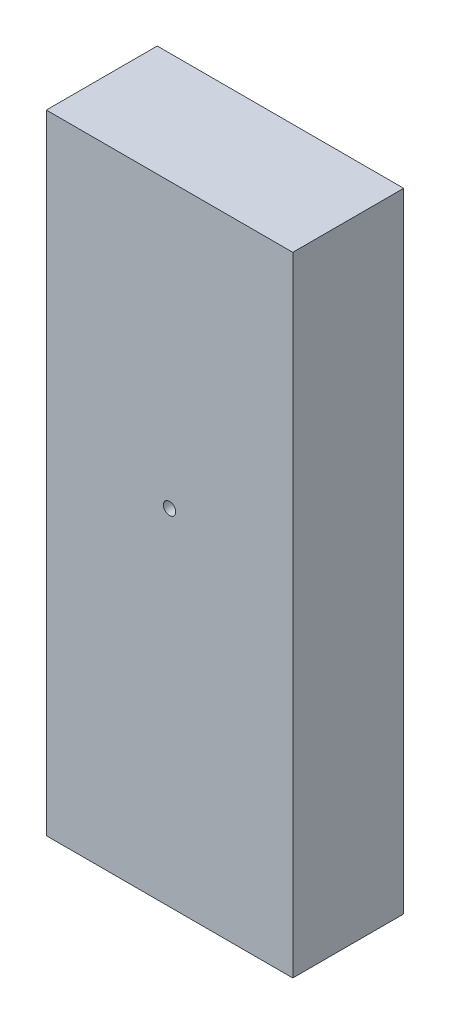
ISO-10303-21;
HEADER;
FILE_DESCRIPTION(('STEP AP214'),'2;1');
FILE_NAME('part.step','',(''),(''),'','','');
FILE_SCHEMA(('AUTOMOTIVE_DESIGN { 1 0 10303 214 1 1 1 1 }'));
ENDSEC;
DATA;
#1=APPLICATION_CONTEXT('core data for automotive mechanical design processes');
#2=APPLICATION_PROTOCOL_DEFINITION('international standard','automotive_design',2000,#1);
#3=PRODUCT_CONTEXT('',#1,'mechanical');
#4=PRODUCT('Part','Part','',(#3));
#5=PRODUCT_RELATED_PRODUCT_CATEGORY('part','',(#4));
#6=PRODUCT_DEFINITION_FORMATION('','',#4);
#7=PRODUCT_DEFINITION_CONTEXT('part definition',#1,'design');
#8=PRODUCT_DEFINITION('design','',#6,#7);
#9=PRODUCT_DEFINITION_SHAPE('','',#8);
#10=(LENGTH_UNIT() NAMED_UNIT(*) SI_UNIT(.MILLI.,.METRE.));
#11=(NAMED_UNIT(*) PLANE_ANGLE_UNIT() SI_UNIT($,.RADIAN.));
#12=(NAMED_UNIT(*) SI_UNIT($,.STERADIAN.) SOLID_ANGLE_UNIT());
#13=UNCERTAINTY_MEASURE_WITH_UNIT(LENGTH_MEASURE(1.E-05),#10,'distance_accuracy_value','');
#14=(GEOMETRIC_REPRESENTATION_CONTEXT(3) GLOBAL_UNCERTAINTY_ASSIGNED_CONTEXT((#13)) GLOBAL_UNIT_ASSIGNED_CONTEXT((#10,
#11,#12)) REPRESENTATION_CONTEXT('',''));
#15=CARTESIAN_POINT('',(0.,0.,0.));
#16=DIRECTION('',(0.,0.,1.));
#17=DIRECTION('',(1.,0.,0.));
#18=AXIS2_PLACEMENT_3D('',#15,#16,#17);
#19=CARTESIAN_POINT('',(-15.9031235431236,5.08846153846154,9.));
#20=DIRECTION('',(1.,0.,0.));
#21=DIRECTION('',(0.,1.,0.));
#22=AXIS2_PLACEMENT_3D('',#19,#20,#21);
#23=PLANE('',#22);
#24=DIRECTION('',(0.,-1.,0.));
#25=VECTOR('',#24,1.);
#26=CARTESIAN_POINT('',(-15.9031235431236,5.08846153846154,0.));
#27=LINE('',#26,#25);
#28=CARTESIAN_POINT('',(-15.9031235431236,5.08846153846154,0.));
#29=VERTEX_POINT('',#28);
#30=CARTESIAN_POINT('',(-15.9031235431236,-45.9115384615385,0.));
#31=VERTEX_POINT('',#30);
#32=EDGE_CURVE('E93',#29,#31,#27,.T.);
#33=ORIENTED_EDGE('',*,*,#32,.T.);
#34=DIRECTION('',(0.,0.,-1.));
#35=VECTOR('',#34,1.);
#36=CARTESIAN_POINT('',(-15.9031235431236,-45.9115384615385,9.));
#37=LINE('',#36,#35);
#38=CARTESIAN_POINT('',(-15.9031235431236,-45.9115384615385,9.));
#39=VERTEX_POINT('',#38);
#40=EDGE_CURVE('E11',#39,#31,#37,.T.);
#41=ORIENTED_EDGE('',*,*,#40,.F.);
#42=DIRECTION('',(0.,-1.,0.));
#43=VECTOR('',#42,1.);
#44=CARTESIAN_POINT('',(-15.9031235431236,5.08846153846154,9.));
#45=LINE('',#44,#43);
#46=CARTESIAN_POINT('',(-15.9031235431236,5.08846153846154,9.));
#47=VERTEX_POINT('',#46);
#48=EDGE_CURVE('E81',#47,#39,#45,.T.);
#49=ORIENTED_EDGE('',*,*,#48,.F.);
#50=DIRECTION('',(0.,0.,-1.));
#51=VECTOR('',#50,1.);
#52=CARTESIAN_POINT('',(-15.9031235431236,5.08846153846154,9.));
#53=LINE('',#52,#51);
#54=EDGE_CURVE('E89',#47,#29,#53,.T.);
#55=ORIENTED_EDGE('',*,*,#54,.T.);
#56=EDGE_LOOP('',(#33,#41,#49,#55));
#57=FACE_BOUND('',#56,.T.);
#58=ADVANCED_FACE('F30',(#57),#23,.F.);
#59=CARTESIAN_POINT('',(-15.9031235431236,-45.9115384615385,9.));
#60=DIRECTION('',(0.,1.,0.));
#61=DIRECTION('',(0.,0.,1.));
#62=AXIS2_PLACEMENT_3D('',#59,#60,#61);
#63=PLANE('',#62);
#64=DIRECTION('',(1.,0.,0.));
#65=VECTOR('',#64,1.);
#66=CARTESIAN_POINT('',(-15.9031235431236,-45.9115384615385,0.));
#67=LINE('',#66,#65);
#68=CARTESIAN_POINT('',(4.09687645687644,-45.9115384615385,0.));
#69=VERTEX_POINT('',#68);
#70=EDGE_CURVE('E85',#31,#69,#67,.T.);
#71=ORIENTED_EDGE('',*,*,#70,.T.);
#72=DIRECTION('',(0.,0.,-1.));
#73=VECTOR('',#72,1.);
#74=CARTESIAN_POINT('',(4.09687645687644,-45.9115384615385,9.));
#75=LINE('',#74,#73);
#76=CARTESIAN_POINT('',(4.09687645687644,-45.9115384615385,9.));
#77=VERTEX_POINT('',#76);
#78=EDGE_CURVE('E38',#77,#69,#75,.T.);
#79=ORIENTED_EDGE('',*,*,#78,.F.);
#80=DIRECTION('',(1.,0.,0.));
#81=VECTOR('',#80,1.);
#82=CARTESIAN_POINT('',(-15.9031235431236,-45.9115384615385,9.));
#83=LINE('',#82,#81);
#84=EDGE_CURVE('E76',#39,#77,#83,.T.);
#85=ORIENTED_EDGE('',*,*,#84,.F.);
#86=ORIENTED_EDGE('',*,*,#40,.T.);
#87=EDGE_LOOP('',(#71,#79,#85,#86));
#88=FACE_BOUND('',#87,.T.);
#89=ADVANCED_FACE('F84',(#88),#63,.F.);
#90=CARTESIAN_POINT('',(4.09687645687643,5.08846153846154,9.));
#91=DIRECTION('',(-1.,0.,0.));
#92=DIRECTION('',(0.,-1.,0.));
#93=AXIS2_PLACEMENT_3D('',#90,#91,#92);
#94=PLANE('',#93);
#95=DIRECTION('',(0.,1.,0.));
#96=VECTOR('',#95,1.);
#97=CARTESIAN_POINT('',(4.09687645687643,5.08846153846154,0.));
#98=LINE('',#97,#96);
#99=CARTESIAN_POINT('',(4.09687645687643,5.08846153846154,0.));
#100=VERTEX_POINT('',#99);
#101=EDGE_CURVE('E63',#69,#100,#98,.T.);
#102=ORIENTED_EDGE('',*,*,#101,.T.);
#103=DIRECTION('',(0.,0.,-1.));
#104=VECTOR('',#103,1.);
#105=CARTESIAN_POINT('',(4.09687645687643,5.08846153846154,9.));
#106=LINE('',#105,#104);
#107=CARTESIAN_POINT('',(4.09687645687643,5.08846153846154,9.));
#108=VERTEX_POINT('',#107);
#109=EDGE_CURVE('E86',#108,#100,#106,.T.);
#110=ORIENTED_EDGE('',*,*,#109,.F.);
#111=DIRECTION('',(0.,1.,0.));
#112=VECTOR('',#111,1.);
#113=CARTESIAN_POINT('',(4.09687645687643,5.08846153846154,9.));
#114=LINE('',#113,#112);
#115=EDGE_CURVE('E79',#77,#108,#114,.T.);
#116=ORIENTED_EDGE('',*,*,#115,.F.);
#117=ORIENTED_EDGE('',*,*,#78,.T.);
#118=EDGE_LOOP('',(#102,#110,#116,#117));
#119=FACE_BOUND('',#118,.T.);
#120=ADVANCED_FACE('F87',(#119),#94,.F.);
#121=CARTESIAN_POINT('',(-15.9031235431236,5.08846153846154,9.));
#122=DIRECTION('',(0.,-1.,0.));
#123=DIRECTION('',(0.,0.,-1.));
#124=AXIS2_PLACEMENT_3D('',#121,#122,#123);
#125=PLANE('',#124);
#126=DIRECTION('',(-1.,0.,0.));
#127=VECTOR('',#126,1.);
#128=CARTESIAN_POINT('',(-15.9031235431236,5.08846153846154,0.));
#129=LINE('',#128,#127);
#130=EDGE_CURVE('E69',#100,#29,#129,.T.);
#131=ORIENTED_EDGE('',*,*,#130,.T.);
#132=ORIENTED_EDGE('',*,*,#54,.F.);
#133=DIRECTION('',(-1.,0.,0.));
#134=VECTOR('',#133,1.);
#135=CARTESIAN_POINT('',(-15.9031235431236,5.08846153846154,9.));
#136=LINE('',#135,#134);
#137=EDGE_CURVE('E46',#108,#47,#136,.T.);
#138=ORIENTED_EDGE('',*,*,#137,.F.);
#139=ORIENTED_EDGE('',*,*,#109,.T.);
#140=EDGE_LOOP('',(#131,#132,#138,#139));
#141=FACE_BOUND('',#140,.T.);
#142=ADVANCED_FACE('F101',(#141),#125,.F.);
#143=CARTESIAN_POINT('',(-15.9031235431236,-45.9115384615385,9.));
#144=DIRECTION('',(0.,0.,1.));
#145=DIRECTION('',(1.,0.,0.));
#146=AXIS2_PLACEMENT_3D('',#143,#144,#145);
#147=PLANE('',#146);
#148=CARTESIAN_POINT('',(-5.90312354312357,-17.9115384615385,9.));
#149=DIRECTION('',(0.,0.,1.));
#150=DIRECTION('',(1.,0.,0.));
#151=AXIS2_PLACEMENT_3D('',#148,#149,#150);
#152=CIRCLE('',#151,0.500000000000001);
#153=CARTESIAN_POINT('',(-5.40312354312357,-17.9115384615385,9.));
#154=VERTEX_POINT('',#153);
#155=EDGE_CURVE('E109',#154,#154,#152,.T.);
#156=ORIENTED_EDGE('',*,*,#155,.F.);
#157=EDGE_LOOP('',(#156));
#158=FACE_BOUND('',#157,.T.);
#159=ORIENTED_EDGE('',*,*,#48,.T.);
#160=ORIENTED_EDGE('',*,*,#84,.T.);
#161=ORIENTED_EDGE('',*,*,#115,.T.);
#162=ORIENTED_EDGE('',*,*,#137,.T.);
#163=EDGE_LOOP('',(#159,#160,#161,#162));
#164=FACE_BOUND('',#163,.T.);
#165=ADVANCED_FACE('F77',(#158,#164),#147,.T.);
#166=CARTESIAN_POINT('',(-15.9031235431236,-45.9115384615385,0.));
#167=DIRECTION('',(0.,0.,1.));
#168=DIRECTION('',(1.,0.,0.));
#169=AXIS2_PLACEMENT_3D('',#166,#167,#168);
#170=PLANE('',#169);
#171=CARTESIAN_POINT('',(-5.90312354312357,-17.9115384615385,0.));
#172=DIRECTION('',(0.,0.,1.));
#173=DIRECTION('',(1.,0.,0.));
#174=AXIS2_PLACEMENT_3D('',#171,#172,#173);
#175=CIRCLE('',#174,0.500000000000001);
#176=CARTESIAN_POINT('',(-5.40312354312357,-17.9115384615385,0.));
#177=VERTEX_POINT('',#176);
#178=EDGE_CURVE('E96',#177,#177,#175,.F.);
#179=ORIENTED_EDGE('',*,*,#178,.F.);
#180=EDGE_LOOP('',(#179));
#181=FACE_BOUND('',#180,.T.);
#182=ORIENTED_EDGE('',*,*,#32,.F.);
#183=ORIENTED_EDGE('',*,*,#130,.F.);
#184=ORIENTED_EDGE('',*,*,#101,.F.);
#185=ORIENTED_EDGE('',*,*,#70,.F.);
#186=EDGE_LOOP('',(#182,#183,#184,#185));
#187=FACE_BOUND('',#186,.T.);
#188=ADVANCED_FACE('F104',(#181,#187),#170,.F.);
#189=CARTESIAN_POINT('',(-5.90312354312357,-17.9115384615385,-0.000999999999999265));
#190=DIRECTION('',(0.,0.,1.));
#191=DIRECTION('',(1.,0.,0.));
#192=AXIS2_PLACEMENT_3D('',#189,#190,#191);
#193=CYLINDRICAL_SURFACE('',#192,0.500000000000001);
#194=ORIENTED_EDGE('',*,*,#155,.T.);
#195=EDGE_LOOP('',(#194));
#196=FACE_BOUND('',#195,.T.);
#197=ORIENTED_EDGE('',*,*,#178,.T.);
#198=EDGE_LOOP('',(#197));
#199=FACE_BOUND('',#198,.T.);
#200=ADVANCED_FACE('F113',(#196,#199),#193,.F.);
#201=CLOSED_SHELL('',(#58,#89,#120,#142,#165,#188,#200));
#202=MANIFOLD_SOLID_BREP('B2',#201);
#203=ADVANCED_BREP_SHAPE_REPRESENTATION('',(#18,#202),#14);
#204=SHAPE_DEFINITION_REPRESENTATION(#9,#203);
ENDSEC;
END-ISO-10303-21;
